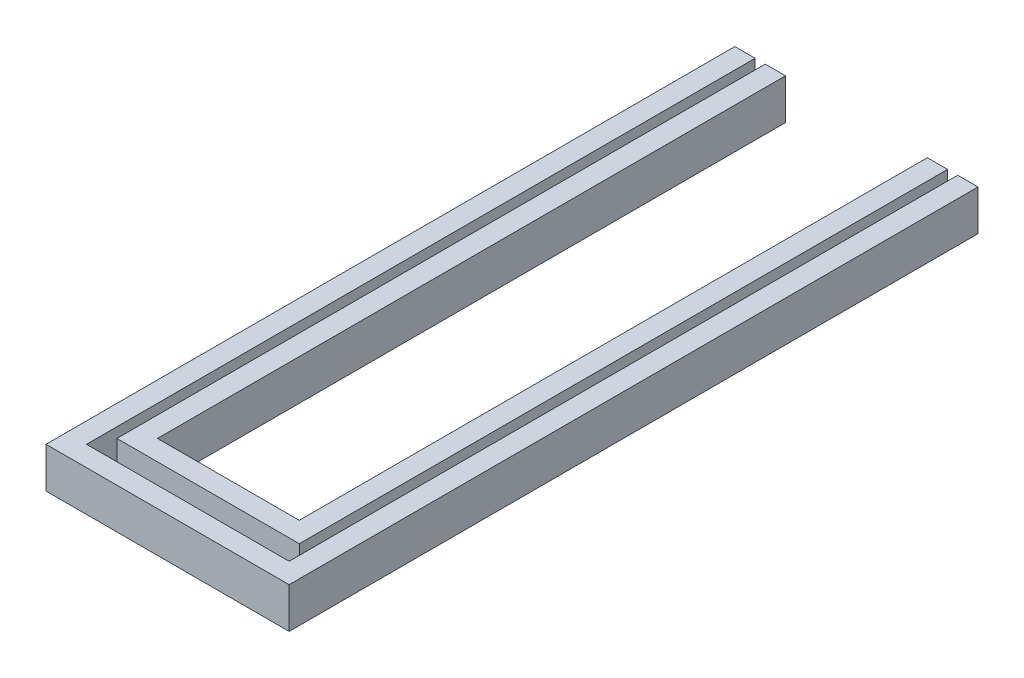
ISO-10303-21;
HEADER;
FILE_DESCRIPTION(('STEP AP214'),'2;1');
FILE_NAME('part.step','',(''),(''),'','','');
FILE_SCHEMA(('AUTOMOTIVE_DESIGN { 1 0 10303 214 1 1 1 1 }'));
ENDSEC;
DATA;
#1=APPLICATION_CONTEXT('core data for automotive mechanical design processes');
#2=APPLICATION_PROTOCOL_DEFINITION('international standard','automotive_design',2000,#1);
#3=PRODUCT_CONTEXT('',#1,'mechanical');
#4=PRODUCT('Part','Part','',(#3));
#5=PRODUCT_RELATED_PRODUCT_CATEGORY('part','',(#4));
#6=PRODUCT_DEFINITION_FORMATION('','',#4);
#7=PRODUCT_DEFINITION_CONTEXT('part definition',#1,'design');
#8=PRODUCT_DEFINITION('design','',#6,#7);
#9=PRODUCT_DEFINITION_SHAPE('','',#8);
#10=(LENGTH_UNIT() NAMED_UNIT(*) SI_UNIT(.MILLI.,.METRE.));
#11=(NAMED_UNIT(*) PLANE_ANGLE_UNIT() SI_UNIT($,.RADIAN.));
#12=(NAMED_UNIT(*) SI_UNIT($,.STERADIAN.) SOLID_ANGLE_UNIT());
#13=UNCERTAINTY_MEASURE_WITH_UNIT(LENGTH_MEASURE(1.E-05),#10,'distance_accuracy_value','');
#14=(GEOMETRIC_REPRESENTATION_CONTEXT(3) GLOBAL_UNCERTAINTY_ASSIGNED_CONTEXT((#13)) GLOBAL_UNIT_ASSIGNED_CONTEXT((#10,
#11,#12)) REPRESENTATION_CONTEXT('',''));
#15=CARTESIAN_POINT('',(0.,0.,0.));
#16=DIRECTION('',(0.,0.,1.));
#17=DIRECTION('',(1.,0.,0.));
#18=AXIS2_PLACEMENT_3D('',#15,#16,#17);
#19=CARTESIAN_POINT('',(38.1000000000001,50.8,0.));
#20=DIRECTION('',(1.,0.,0.));
#21=DIRECTION('',(0.,0.,-1.));
#22=AXIS2_PLACEMENT_3D('',#19,#20,#21);
#23=PLANE('',#22);
#24=DIRECTION('',(0.,0.,1.));
#25=VECTOR('',#24,1.);
#26=CARTESIAN_POINT('',(38.1000000000001,0.,0.));
#27=LINE('',#26,#25);
#28=CARTESIAN_POINT('',(38.1,0.,-863.6));
#29=VERTEX_POINT('',#28);
#30=CARTESIAN_POINT('',(38.1000000000001,0.,-50.8));
#31=VERTEX_POINT('',#30);
#32=EDGE_CURVE('E188',#29,#31,#27,.T.);
#33=ORIENTED_EDGE('',*,*,#32,.T.);
#34=DIRECTION('',(0.,-1.,0.));
#35=VECTOR('',#34,1.);
#36=CARTESIAN_POINT('',(38.1000000000001,50.8,-50.8));
#37=LINE('',#36,#35);
#38=CARTESIAN_POINT('',(38.1000000000001,50.8,-50.8));
#39=VERTEX_POINT('',#38);
#40=EDGE_CURVE('E13',#39,#31,#37,.T.);
#41=ORIENTED_EDGE('',*,*,#40,.F.);
#42=DIRECTION('',(0.,0.,1.));
#43=VECTOR('',#42,1.);
#44=CARTESIAN_POINT('',(38.1000000000001,50.8,0.));
#45=LINE('',#44,#43);
#46=CARTESIAN_POINT('',(38.1,50.8,-863.6));
#47=VERTEX_POINT('',#46);
#48=EDGE_CURVE('E208',#47,#39,#45,.T.);
#49=ORIENTED_EDGE('',*,*,#48,.F.);
#50=DIRECTION('',(0.,-1.,0.));
#51=VECTOR('',#50,1.);
#52=CARTESIAN_POINT('',(38.1,50.8,-863.6));
#53=LINE('',#52,#51);
#54=EDGE_CURVE('E107',#47,#29,#53,.T.);
#55=ORIENTED_EDGE('',*,*,#54,.T.);
#56=EDGE_LOOP('',(#33,#41,#49,#55));
#57=FACE_BOUND('',#56,.T.);
#58=ADVANCED_FACE('F91',(#57),#23,.F.);
#59=CARTESIAN_POINT('',(0.,50.8,-50.8));
#60=DIRECTION('',(0.,0.,-1.));
#61=DIRECTION('',(-1.,0.,0.));
#62=AXIS2_PLACEMENT_3D('',#59,#60,#61);
#63=PLANE('',#62);
#64=DIRECTION('',(1.,0.,0.));
#65=VECTOR('',#64,1.);
#66=CARTESIAN_POINT('',(0.,0.,-50.8));
#67=LINE('',#66,#65);
#68=CARTESIAN_POINT('',(266.7,0.,-50.8));
#69=VERTEX_POINT('',#68);
#70=EDGE_CURVE('E190',#31,#69,#67,.T.);
#71=ORIENTED_EDGE('',*,*,#70,.T.);
#72=DIRECTION('',(0.,-1.,0.));
#73=VECTOR('',#72,1.);
#74=CARTESIAN_POINT('',(266.7,50.8,-50.8));
#75=LINE('',#74,#73);
#76=CARTESIAN_POINT('',(266.7,50.8,-50.8));
#77=VERTEX_POINT('',#76);
#78=EDGE_CURVE('E99',#77,#69,#75,.T.);
#79=ORIENTED_EDGE('',*,*,#78,.F.);
#80=DIRECTION('',(1.,0.,0.));
#81=VECTOR('',#80,1.);
#82=CARTESIAN_POINT('',(0.,50.8,-50.8));
#83=LINE('',#82,#81);
#84=EDGE_CURVE('E145',#39,#77,#83,.T.);
#85=ORIENTED_EDGE('',*,*,#84,.F.);
#86=ORIENTED_EDGE('',*,*,#40,.T.);
#87=EDGE_LOOP('',(#71,#79,#85,#86));
#88=FACE_BOUND('',#87,.T.);
#89=ADVANCED_FACE('F221',(#88),#63,.F.);
#90=CARTESIAN_POINT('',(266.7,50.8,0.));
#91=DIRECTION('',(1.,0.,0.));
#92=DIRECTION('',(0.,0.,-1.));
#93=AXIS2_PLACEMENT_3D('',#90,#91,#92);
#94=PLANE('',#93);
#95=DIRECTION('',(0.,0.,1.));
#96=VECTOR('',#95,1.);
#97=CARTESIAN_POINT('',(266.7,0.,0.));
#98=LINE('',#97,#96);
#99=CARTESIAN_POINT('',(266.7,0.,-863.6));
#100=VERTEX_POINT('',#99);
#101=EDGE_CURVE('E193',#100,#69,#98,.T.);
#102=ORIENTED_EDGE('',*,*,#101,.F.);
#103=DIRECTION('',(0.,-1.,0.));
#104=VECTOR('',#103,1.);
#105=CARTESIAN_POINT('',(266.7,50.8,-863.6));
#106=LINE('',#105,#104);
#107=CARTESIAN_POINT('',(266.7,50.8,-863.6));
#108=VERTEX_POINT('',#107);
#109=EDGE_CURVE('E214',#108,#100,#106,.T.);
#110=ORIENTED_EDGE('',*,*,#109,.F.);
#111=DIRECTION('',(0.,0.,1.));
#112=VECTOR('',#111,1.);
#113=CARTESIAN_POINT('',(266.7,50.8,0.));
#114=LINE('',#113,#112);
#115=EDGE_CURVE('E220',#108,#77,#114,.T.);
#116=ORIENTED_EDGE('',*,*,#115,.T.);
#117=ORIENTED_EDGE('',*,*,#78,.T.);
#118=EDGE_LOOP('',(#102,#110,#116,#117));
#119=FACE_BOUND('',#118,.T.);
#120=ADVANCED_FACE('F218',(#119),#94,.T.);
#121=CARTESIAN_POINT('',(0.,50.8,-863.6));
#122=DIRECTION('',(0.,0.,-1.));
#123=DIRECTION('',(-1.,0.,0.));
#124=AXIS2_PLACEMENT_3D('',#121,#122,#123);
#125=PLANE('',#124);
#126=DIRECTION('',(1.,0.,0.));
#127=VECTOR('',#126,1.);
#128=CARTESIAN_POINT('',(0.,0.,-863.6));
#129=LINE('',#128,#127);
#130=CARTESIAN_POINT('',(241.3,0.,-863.6));
#131=VERTEX_POINT('',#130);
#132=EDGE_CURVE('E196',#131,#100,#129,.T.);
#133=ORIENTED_EDGE('',*,*,#132,.F.);
#134=DIRECTION('',(0.,-1.,0.));
#135=VECTOR('',#134,1.);
#136=CARTESIAN_POINT('',(241.3,50.8,-863.6));
#137=LINE('',#136,#135);
#138=CARTESIAN_POINT('',(241.3,50.8,-863.6));
#139=VERTEX_POINT('',#138);
#140=EDGE_CURVE('E212',#139,#131,#137,.T.);
#141=ORIENTED_EDGE('',*,*,#140,.F.);
#142=DIRECTION('',(1.,0.,0.));
#143=VECTOR('',#142,1.);
#144=CARTESIAN_POINT('',(0.,50.8,-863.6));
#145=LINE('',#144,#143);
#146=EDGE_CURVE('E230',#139,#108,#145,.T.);
#147=ORIENTED_EDGE('',*,*,#146,.T.);
#148=ORIENTED_EDGE('',*,*,#109,.T.);
#149=EDGE_LOOP('',(#133,#141,#147,#148));
#150=FACE_BOUND('',#149,.T.);
#151=ADVANCED_FACE('F228',(#150),#125,.T.);
#152=CARTESIAN_POINT('',(241.3,50.8,0.));
#153=DIRECTION('',(1.,0.,0.));
#154=DIRECTION('',(0.,0.,-1.));
#155=AXIS2_PLACEMENT_3D('',#152,#153,#154);
#156=PLANE('',#155);
#157=DIRECTION('',(0.,0.,1.));
#158=VECTOR('',#157,1.);
#159=CARTESIAN_POINT('',(241.3,0.,0.));
#160=LINE('',#159,#158);
#161=CARTESIAN_POINT('',(241.3,0.,-76.2));
#162=VERTEX_POINT('',#161);
#163=EDGE_CURVE('E199',#131,#162,#160,.T.);
#164=ORIENTED_EDGE('',*,*,#163,.T.);
#165=DIRECTION('',(0.,-1.,0.));
#166=VECTOR('',#165,1.);
#167=CARTESIAN_POINT('',(241.3,50.8,-76.2));
#168=LINE('',#167,#166);
#169=CARTESIAN_POINT('',(241.3,50.8,-76.2));
#170=VERTEX_POINT('',#169);
#171=EDGE_CURVE('E170',#170,#162,#168,.T.);
#172=ORIENTED_EDGE('',*,*,#171,.F.);
#173=DIRECTION('',(0.,0.,1.));
#174=VECTOR('',#173,1.);
#175=CARTESIAN_POINT('',(241.3,50.8,0.));
#176=LINE('',#175,#174);
#177=EDGE_CURVE('E179',#139,#170,#176,.T.);
#178=ORIENTED_EDGE('',*,*,#177,.F.);
#179=ORIENTED_EDGE('',*,*,#140,.T.);
#180=EDGE_LOOP('',(#164,#172,#178,#179));
#181=FACE_BOUND('',#180,.T.);
#182=ADVANCED_FACE('F256',(#181),#156,.F.);
#183=CARTESIAN_POINT('',(0.,50.8,-76.2));
#184=DIRECTION('',(0.,0.,-1.));
#185=DIRECTION('',(-1.,0.,0.));
#186=AXIS2_PLACEMENT_3D('',#183,#184,#185);
#187=PLANE('',#186);
#188=DIRECTION('',(1.,0.,0.));
#189=VECTOR('',#188,1.);
#190=CARTESIAN_POINT('',(0.,0.,-76.2));
#191=LINE('',#190,#189);
#192=CARTESIAN_POINT('',(63.5000000000001,0.,-76.2));
#193=VERTEX_POINT('',#192);
#194=EDGE_CURVE('E166',#193,#162,#191,.T.);
#195=ORIENTED_EDGE('',*,*,#194,.F.);
#196=DIRECTION('',(0.,-1.,0.));
#197=VECTOR('',#196,1.);
#198=CARTESIAN_POINT('',(63.5000000000001,50.8,-76.2));
#199=LINE('',#198,#197);
#200=CARTESIAN_POINT('',(63.5000000000001,50.8,-76.2));
#201=VERTEX_POINT('',#200);
#202=EDGE_CURVE('E161',#201,#193,#199,.T.);
#203=ORIENTED_EDGE('',*,*,#202,.F.);
#204=DIRECTION('',(1.,0.,0.));
#205=VECTOR('',#204,1.);
#206=CARTESIAN_POINT('',(0.,50.8,-76.2));
#207=LINE('',#206,#205);
#208=EDGE_CURVE('E164',#201,#170,#207,.T.);
#209=ORIENTED_EDGE('',*,*,#208,.T.);
#210=ORIENTED_EDGE('',*,*,#171,.T.);
#211=EDGE_LOOP('',(#195,#203,#209,#210));
#212=FACE_BOUND('',#211,.T.);
#213=ADVANCED_FACE('F163',(#212),#187,.T.);
#214=CARTESIAN_POINT('',(63.5000000000001,50.8,0.));
#215=DIRECTION('',(1.,0.,0.));
#216=DIRECTION('',(0.,0.,-1.));
#217=AXIS2_PLACEMENT_3D('',#214,#215,#216);
#218=PLANE('',#217);
#219=DIRECTION('',(0.,0.,1.));
#220=VECTOR('',#219,1.);
#221=CARTESIAN_POINT('',(63.5000000000001,0.,0.));
#222=LINE('',#221,#220);
#223=CARTESIAN_POINT('',(63.5,0.,-863.6));
#224=VERTEX_POINT('',#223);
#225=EDGE_CURVE('E203',#224,#193,#222,.T.);
#226=ORIENTED_EDGE('',*,*,#225,.F.);
#227=DIRECTION('',(0.,-1.,0.));
#228=VECTOR('',#227,1.);
#229=CARTESIAN_POINT('',(63.5,50.8,-863.6));
#230=LINE('',#229,#228);
#231=CARTESIAN_POINT('',(63.5,50.8,-863.6));
#232=VERTEX_POINT('',#231);
#233=EDGE_CURVE('E133',#232,#224,#230,.T.);
#234=ORIENTED_EDGE('',*,*,#233,.F.);
#235=DIRECTION('',(0.,0.,1.));
#236=VECTOR('',#235,1.);
#237=CARTESIAN_POINT('',(63.5000000000001,50.8,0.));
#238=LINE('',#237,#236);
#239=EDGE_CURVE('E176',#232,#201,#238,.T.);
#240=ORIENTED_EDGE('',*,*,#239,.T.);
#241=ORIENTED_EDGE('',*,*,#202,.T.);
#242=EDGE_LOOP('',(#226,#234,#240,#241));
#243=FACE_BOUND('',#242,.T.);
#244=ADVANCED_FACE('F182',(#243),#218,.T.);
#245=CARTESIAN_POINT('',(0.,50.8,-863.6));
#246=DIRECTION('',(0.,0.,-1.));
#247=DIRECTION('',(-1.,0.,0.));
#248=AXIS2_PLACEMENT_3D('',#245,#246,#247);
#249=PLANE('',#248);
#250=DIRECTION('',(1.,0.,0.));
#251=VECTOR('',#250,1.);
#252=CARTESIAN_POINT('',(0.,0.,-863.6));
#253=LINE('',#252,#251);
#254=EDGE_CURVE('E205',#29,#224,#253,.T.);
#255=ORIENTED_EDGE('',*,*,#254,.F.);
#256=ORIENTED_EDGE('',*,*,#54,.F.);
#257=DIRECTION('',(1.,0.,0.));
#258=VECTOR('',#257,1.);
#259=CARTESIAN_POINT('',(0.,50.8,-863.6));
#260=LINE('',#259,#258);
#261=EDGE_CURVE('E183',#47,#232,#260,.T.);
#262=ORIENTED_EDGE('',*,*,#261,.T.);
#263=ORIENTED_EDGE('',*,*,#233,.T.);
#264=EDGE_LOOP('',(#255,#256,#262,#263));
#265=FACE_BOUND('',#264,.T.);
#266=ADVANCED_FACE('F235',(#265),#249,.T.);
#267=CARTESIAN_POINT('',(0.,50.8,0.));
#268=DIRECTION('',(0.,1.,0.));
#269=DIRECTION('',(0.,0.,1.));
#270=AXIS2_PLACEMENT_3D('',#267,#268,#269);
#271=PLANE('',#270);
#272=ORIENTED_EDGE('',*,*,#48,.T.);
#273=ORIENTED_EDGE('',*,*,#84,.T.);
#274=ORIENTED_EDGE('',*,*,#115,.F.);
#275=ORIENTED_EDGE('',*,*,#146,.F.);
#276=ORIENTED_EDGE('',*,*,#177,.T.);
#277=ORIENTED_EDGE('',*,*,#208,.F.);
#278=ORIENTED_EDGE('',*,*,#239,.F.);
#279=ORIENTED_EDGE('',*,*,#261,.F.);
#280=EDGE_LOOP('',(#272,#273,#274,#275,#276,#277,#278,#279));
#281=FACE_BOUND('',#280,.T.);
#282=ADVANCED_FACE('F174',(#281),#271,.T.);
#283=CARTESIAN_POINT('',(0.,0.,0.));
#284=DIRECTION('',(0.,1.,0.));
#285=DIRECTION('',(0.,0.,1.));
#286=AXIS2_PLACEMENT_3D('',#283,#284,#285);
#287=PLANE('',#286);
#288=ORIENTED_EDGE('',*,*,#32,.F.);
#289=ORIENTED_EDGE('',*,*,#254,.T.);
#290=ORIENTED_EDGE('',*,*,#225,.T.);
#291=ORIENTED_EDGE('',*,*,#194,.T.);
#292=ORIENTED_EDGE('',*,*,#163,.F.);
#293=ORIENTED_EDGE('',*,*,#132,.T.);
#294=ORIENTED_EDGE('',*,*,#101,.T.);
#295=ORIENTED_EDGE('',*,*,#70,.F.);
#296=EDGE_LOOP('',(#288,#289,#290,#291,#292,#293,#294,#295));
#297=FACE_BOUND('',#296,.T.);
#298=ADVANCED_FACE('F224',(#297),#287,.F.);
#299=CLOSED_SHELL('',(#58,#89,#120,#151,#182,#213,#244,#266,#282,#298));
#300=MANIFOLD_SOLID_BREP('B2',#299);
#301=CARTESIAN_POINT('',(0.,50.8,0.));
#302=DIRECTION('',(0.,0.,-1.));
#303=DIRECTION('',(-1.,0.,0.));
#304=AXIS2_PLACEMENT_3D('',#301,#302,#303);
#305=PLANE('',#304);
#306=DIRECTION('',(1.,0.,0.));
#307=VECTOR('',#306,1.);
#308=CARTESIAN_POINT('',(0.,0.,0.));
#309=LINE('',#308,#307);
#310=CARTESIAN_POINT('',(0.,0.,0.));
#311=VERTEX_POINT('',#310);
#312=CARTESIAN_POINT('',(304.8,0.,0.));
#313=VERTEX_POINT('',#312);
#314=EDGE_CURVE('E416',#311,#313,#309,.T.);
#315=ORIENTED_EDGE('',*,*,#314,.T.);
#316=DIRECTION('',(0.,-1.,0.));
#317=VECTOR('',#316,1.);
#318=CARTESIAN_POINT('',(304.8,50.8,0.));
#319=LINE('',#318,#317);
#320=CARTESIAN_POINT('',(304.8,50.8,0.));
#321=VERTEX_POINT('',#320);
#322=EDGE_CURVE('E89',#321,#313,#319,.T.);
#323=ORIENTED_EDGE('',*,*,#322,.F.);
#324=DIRECTION('',(1.,0.,0.));
#325=VECTOR('',#324,1.);
#326=CARTESIAN_POINT('',(0.,50.8,0.));
#327=LINE('',#326,#325);
#328=CARTESIAN_POINT('',(0.,50.8,0.));
#329=VERTEX_POINT('',#328);
#330=EDGE_CURVE('E436',#329,#321,#327,.T.);
#331=ORIENTED_EDGE('',*,*,#330,.F.);
#332=DIRECTION('',(0.,-1.,0.));
#333=VECTOR('',#332,1.);
#334=CARTESIAN_POINT('',(0.,50.8,0.));
#335=LINE('',#334,#333);
#336=EDGE_CURVE('E335',#329,#311,#335,.T.);
#337=ORIENTED_EDGE('',*,*,#336,.T.);
#338=EDGE_LOOP('',(#315,#323,#331,#337));
#339=FACE_BOUND('',#338,.T.);
#340=ADVANCED_FACE('F319',(#339),#305,.F.);
#341=CARTESIAN_POINT('',(304.8,50.8,0.));
#342=DIRECTION('',(-1.,0.,0.));
#343=DIRECTION('',(0.,0.,1.));
#344=AXIS2_PLACEMENT_3D('',#341,#342,#343);
#345=PLANE('',#344);
#346=DIRECTION('',(0.,0.,-1.));
#347=VECTOR('',#346,1.);
#348=CARTESIAN_POINT('',(304.8,0.,0.));
#349=LINE('',#348,#347);
#350=CARTESIAN_POINT('',(304.8,0.,-863.6));
#351=VERTEX_POINT('',#350);
#352=EDGE_CURVE('E418',#313,#351,#349,.T.);
#353=ORIENTED_EDGE('',*,*,#352,.T.);
#354=DIRECTION('',(0.,-1.,0.));
#355=VECTOR('',#354,1.);
#356=CARTESIAN_POINT('',(304.8,50.8,-863.6));
#357=LINE('',#356,#355);
#358=CARTESIAN_POINT('',(304.8,50.8,-863.6));
#359=VERTEX_POINT('',#358);
#360=EDGE_CURVE('E327',#359,#351,#357,.T.);
#361=ORIENTED_EDGE('',*,*,#360,.F.);
#362=DIRECTION('',(0.,0.,-1.));
#363=VECTOR('',#362,1.);
#364=CARTESIAN_POINT('',(304.8,50.8,0.));
#365=LINE('',#364,#363);
#366=EDGE_CURVE('E373',#321,#359,#365,.T.);
#367=ORIENTED_EDGE('',*,*,#366,.F.);
#368=ORIENTED_EDGE('',*,*,#322,.T.);
#369=EDGE_LOOP('',(#353,#361,#367,#368));
#370=FACE_BOUND('',#369,.T.);
#371=ADVANCED_FACE('F449',(#370),#345,.F.);
#372=CARTESIAN_POINT('',(0.,50.8,-863.6));
#373=DIRECTION('',(0.,0.,-1.));
#374=DIRECTION('',(-1.,0.,0.));
#375=AXIS2_PLACEMENT_3D('',#372,#373,#374);
#376=PLANE('',#375);
#377=DIRECTION('',(1.,0.,0.));
#378=VECTOR('',#377,1.);
#379=CARTESIAN_POINT('',(0.,0.,-863.6));
#380=LINE('',#379,#378);
#381=CARTESIAN_POINT('',(279.4,0.,-863.6));
#382=VERTEX_POINT('',#381);
#383=EDGE_CURVE('E421',#382,#351,#380,.T.);
#384=ORIENTED_EDGE('',*,*,#383,.F.);
#385=DIRECTION('',(0.,-1.,0.));
#386=VECTOR('',#385,1.);
#387=CARTESIAN_POINT('',(279.4,50.8,-863.6));
#388=LINE('',#387,#386);
#389=CARTESIAN_POINT('',(279.4,50.8,-863.6));
#390=VERTEX_POINT('',#389);
#391=EDGE_CURVE('E442',#390,#382,#388,.T.);
#392=ORIENTED_EDGE('',*,*,#391,.F.);
#393=DIRECTION('',(1.,0.,0.));
#394=VECTOR('',#393,1.);
#395=CARTESIAN_POINT('',(0.,50.8,-863.6));
#396=LINE('',#395,#394);
#397=EDGE_CURVE('E448',#390,#359,#396,.T.);
#398=ORIENTED_EDGE('',*,*,#397,.T.);
#399=ORIENTED_EDGE('',*,*,#360,.T.);
#400=EDGE_LOOP('',(#384,#392,#398,#399));
#401=FACE_BOUND('',#400,.T.);
#402=ADVANCED_FACE('F446',(#401),#376,.T.);
#403=CARTESIAN_POINT('',(279.4,50.8,0.));
#404=DIRECTION('',(-1.,0.,0.));
#405=DIRECTION('',(0.,0.,1.));
#406=AXIS2_PLACEMENT_3D('',#403,#404,#405);
#407=PLANE('',#406);
#408=DIRECTION('',(0.,0.,-1.));
#409=VECTOR('',#408,1.);
#410=CARTESIAN_POINT('',(279.4,0.,0.));
#411=LINE('',#410,#409);
#412=CARTESIAN_POINT('',(279.4,0.,-25.4));
#413=VERTEX_POINT('',#412);
#414=EDGE_CURVE('E424',#413,#382,#411,.T.);
#415=ORIENTED_EDGE('',*,*,#414,.F.);
#416=DIRECTION('',(0.,-1.,0.));
#417=VECTOR('',#416,1.);
#418=CARTESIAN_POINT('',(279.4,50.8,-25.4));
#419=LINE('',#418,#417);
#420=CARTESIAN_POINT('',(279.4,50.8,-25.4));
#421=VERTEX_POINT('',#420);
#422=EDGE_CURVE('E440',#421,#413,#419,.T.);
#423=ORIENTED_EDGE('',*,*,#422,.F.);
#424=DIRECTION('',(0.,0.,-1.));
#425=VECTOR('',#424,1.);
#426=CARTESIAN_POINT('',(279.4,50.8,0.));
#427=LINE('',#426,#425);
#428=EDGE_CURVE('E458',#421,#390,#427,.T.);
#429=ORIENTED_EDGE('',*,*,#428,.T.);
#430=ORIENTED_EDGE('',*,*,#391,.T.);
#431=EDGE_LOOP('',(#415,#423,#429,#430));
#432=FACE_BOUND('',#431,.T.);
#433=ADVANCED_FACE('F456',(#432),#407,.T.);
#434=CARTESIAN_POINT('',(0.,50.8,-25.4));
#435=DIRECTION('',(0.,0.,-1.));
#436=DIRECTION('',(-1.,0.,0.));
#437=AXIS2_PLACEMENT_3D('',#434,#435,#436);
#438=PLANE('',#437);
#439=DIRECTION('',(1.,0.,0.));
#440=VECTOR('',#439,1.);
#441=CARTESIAN_POINT('',(0.,0.,-25.4));
#442=LINE('',#441,#440);
#443=CARTESIAN_POINT('',(25.4,0.,-25.4));
#444=VERTEX_POINT('',#443);
#445=EDGE_CURVE('E427',#444,#413,#442,.T.);
#446=ORIENTED_EDGE('',*,*,#445,.F.);
#447=DIRECTION('',(0.,-1.,0.));
#448=VECTOR('',#447,1.);
#449=CARTESIAN_POINT('',(25.4,50.8,-25.4));
#450=LINE('',#449,#448);
#451=CARTESIAN_POINT('',(25.4,50.8,-25.4));
#452=VERTEX_POINT('',#451);
#453=EDGE_CURVE('E408',#452,#444,#450,.T.);
#454=ORIENTED_EDGE('',*,*,#453,.F.);
#455=DIRECTION('',(1.,0.,0.));
#456=VECTOR('',#455,1.);
#457=CARTESIAN_POINT('',(0.,50.8,-25.4));
#458=LINE('',#457,#456);
#459=EDGE_CURVE('E398',#452,#421,#458,.T.);
#460=ORIENTED_EDGE('',*,*,#459,.T.);
#461=ORIENTED_EDGE('',*,*,#422,.T.);
#462=EDGE_LOOP('',(#446,#454,#460,#461));
#463=FACE_BOUND('',#462,.T.);
#464=ADVANCED_FACE('F464',(#463),#438,.T.);
#465=CARTESIAN_POINT('',(25.4,50.8,0.));
#466=DIRECTION('',(-1.,0.,0.));
#467=DIRECTION('',(0.,0.,1.));
#468=AXIS2_PLACEMENT_3D('',#465,#466,#467);
#469=PLANE('',#468);
#470=DIRECTION('',(0.,0.,-1.));
#471=VECTOR('',#470,1.);
#472=CARTESIAN_POINT('',(25.4,0.,0.));
#473=LINE('',#472,#471);
#474=CARTESIAN_POINT('',(25.4,0.,-863.6));
#475=VERTEX_POINT('',#474);
#476=EDGE_CURVE('E405',#444,#475,#473,.T.);
#477=ORIENTED_EDGE('',*,*,#476,.T.);
#478=DIRECTION('',(0.,-1.,0.));
#479=VECTOR('',#478,1.);
#480=CARTESIAN_POINT('',(25.4,50.8,-863.6));
#481=LINE('',#480,#479);
#482=CARTESIAN_POINT('',(25.4,50.8,-863.6));
#483=VERTEX_POINT('',#482);
#484=EDGE_CURVE('E402',#483,#475,#481,.T.);
#485=ORIENTED_EDGE('',*,*,#484,.F.);
#486=DIRECTION('',(0.,0.,-1.));
#487=VECTOR('',#486,1.);
#488=CARTESIAN_POINT('',(25.4,50.8,0.));
#489=LINE('',#488,#487);
#490=EDGE_CURVE('E390',#452,#483,#489,.T.);
#491=ORIENTED_EDGE('',*,*,#490,.F.);
#492=ORIENTED_EDGE('',*,*,#453,.T.);
#493=EDGE_LOOP('',(#477,#485,#491,#492));
#494=FACE_BOUND('',#493,.T.);
#495=ADVANCED_FACE('F403',(#494),#469,.F.);
#496=CARTESIAN_POINT('',(0.,50.8,-863.6));
#497=DIRECTION('',(0.,0.,-1.));
#498=DIRECTION('',(-1.,0.,0.));
#499=AXIS2_PLACEMENT_3D('',#496,#497,#498);
#500=PLANE('',#499);
#501=DIRECTION('',(1.,0.,0.));
#502=VECTOR('',#501,1.);
#503=CARTESIAN_POINT('',(0.,0.,-863.6));
#504=LINE('',#503,#502);
#505=CARTESIAN_POINT('',(0.,0.,-863.6));
#506=VERTEX_POINT('',#505);
#507=EDGE_CURVE('E431',#506,#475,#504,.T.);
#508=ORIENTED_EDGE('',*,*,#507,.F.);
#509=DIRECTION('',(0.,-1.,0.));
#510=VECTOR('',#509,1.);
#511=CARTESIAN_POINT('',(0.,50.8,-863.6));
#512=LINE('',#511,#510);
#513=CARTESIAN_POINT('',(0.,50.8,-863.6));
#514=VERTEX_POINT('',#513);
#515=EDGE_CURVE('E361',#514,#506,#512,.T.);
#516=ORIENTED_EDGE('',*,*,#515,.F.);
#517=DIRECTION('',(1.,0.,0.));
#518=VECTOR('',#517,1.);
#519=CARTESIAN_POINT('',(0.,50.8,-863.6));
#520=LINE('',#519,#518);
#521=EDGE_CURVE('E395',#514,#483,#520,.T.);
#522=ORIENTED_EDGE('',*,*,#521,.T.);
#523=ORIENTED_EDGE('',*,*,#484,.T.);
#524=EDGE_LOOP('',(#508,#516,#522,#523));
#525=FACE_BOUND('',#524,.T.);
#526=ADVANCED_FACE('F410',(#525),#500,.T.);
#527=CARTESIAN_POINT('',(0.,50.8,0.));
#528=DIRECTION('',(-1.,0.,0.));
#529=DIRECTION('',(0.,0.,1.));
#530=AXIS2_PLACEMENT_3D('',#527,#528,#529);
#531=PLANE('',#530);
#532=DIRECTION('',(0.,0.,-1.));
#533=VECTOR('',#532,1.);
#534=CARTESIAN_POINT('',(0.,0.,0.));
#535=LINE('',#534,#533);
#536=EDGE_CURVE('E433',#311,#506,#535,.T.);
#537=ORIENTED_EDGE('',*,*,#536,.F.);
#538=ORIENTED_EDGE('',*,*,#336,.F.);
#539=DIRECTION('',(0.,0.,-1.));
#540=VECTOR('',#539,1.);
#541=CARTESIAN_POINT('',(0.,50.8,0.));
#542=LINE('',#541,#540);
#543=EDGE_CURVE('E411',#329,#514,#542,.T.);
#544=ORIENTED_EDGE('',*,*,#543,.T.);
#545=ORIENTED_EDGE('',*,*,#515,.T.);
#546=EDGE_LOOP('',(#537,#538,#544,#545));
#547=FACE_BOUND('',#546,.T.);
#548=ADVANCED_FACE('F465',(#547),#531,.T.);
#549=CARTESIAN_POINT('',(0.,50.8,0.));
#550=DIRECTION('',(0.,1.,0.));
#551=DIRECTION('',(0.,0.,1.));
#552=AXIS2_PLACEMENT_3D('',#549,#550,#551);
#553=PLANE('',#552);
#554=ORIENTED_EDGE('',*,*,#330,.T.);
#555=ORIENTED_EDGE('',*,*,#366,.T.);
#556=ORIENTED_EDGE('',*,*,#397,.F.);
#557=ORIENTED_EDGE('',*,*,#428,.F.);
#558=ORIENTED_EDGE('',*,*,#459,.F.);
#559=ORIENTED_EDGE('',*,*,#490,.T.);
#560=ORIENTED_EDGE('',*,*,#521,.F.);
#561=ORIENTED_EDGE('',*,*,#543,.F.);
#562=EDGE_LOOP('',(#554,#555,#556,#557,#558,#559,#560,#561));
#563=FACE_BOUND('',#562,.T.);
#564=ADVANCED_FACE('F392',(#563),#553,.T.);
#565=CARTESIAN_POINT('',(0.,0.,0.));
#566=DIRECTION('',(0.,1.,0.));
#567=DIRECTION('',(0.,0.,1.));
#568=AXIS2_PLACEMENT_3D('',#565,#566,#567);
#569=PLANE('',#568);
#570=ORIENTED_EDGE('',*,*,#314,.F.);
#571=ORIENTED_EDGE('',*,*,#536,.T.);
#572=ORIENTED_EDGE('',*,*,#507,.T.);
#573=ORIENTED_EDGE('',*,*,#476,.F.);
#574=ORIENTED_EDGE('',*,*,#445,.T.);
#575=ORIENTED_EDGE('',*,*,#414,.T.);
#576=ORIENTED_EDGE('',*,*,#383,.T.);
#577=ORIENTED_EDGE('',*,*,#352,.F.);
#578=EDGE_LOOP('',(#570,#571,#572,#573,#574,#575,#576,#577));
#579=FACE_BOUND('',#578,.T.);
#580=ADVANCED_FACE('F452',(#579),#569,.F.);
#581=CLOSED_SHELL('',(#340,#371,#402,#433,#464,#495,#526,#548,#564,#580));
#582=MANIFOLD_SOLID_BREP('B7',#581);
#583=ADVANCED_BREP_SHAPE_REPRESENTATION('',(#18,#300,#582),#14);
#584=SHAPE_DEFINITION_REPRESENTATION(#9,#583);
ENDSEC;
END-ISO-10303-21;
